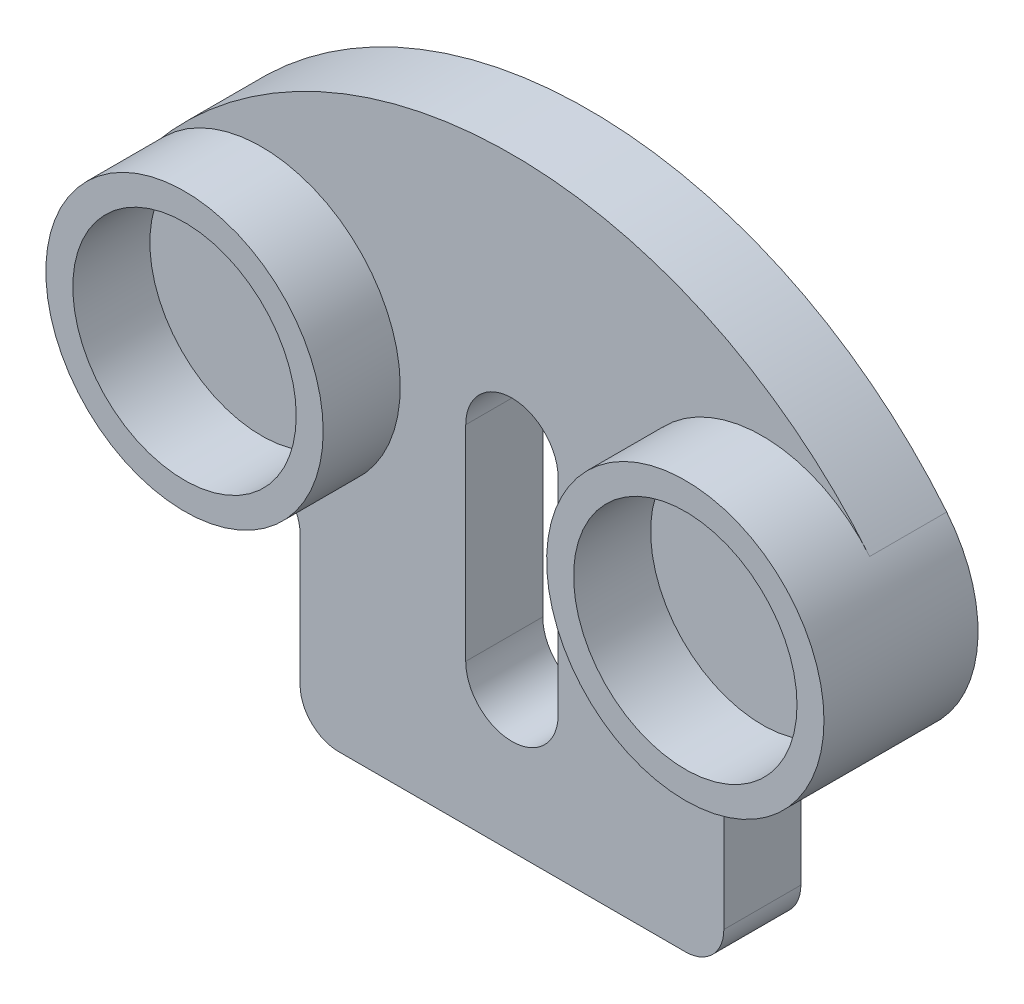
ISO-10303-21;
HEADER;
FILE_DESCRIPTION(('STEP AP214'),'2;1');
FILE_NAME('part.step','',(''),(''),'','','');
FILE_SCHEMA(('AUTOMOTIVE_DESIGN { 1 0 10303 214 1 1 1 1 }'));
ENDSEC;
DATA;
#1=APPLICATION_CONTEXT('core data for automotive mechanical design processes');
#2=APPLICATION_PROTOCOL_DEFINITION('international standard','automotive_design',2000,#1);
#3=PRODUCT_CONTEXT('',#1,'mechanical');
#4=PRODUCT('Part','Part','',(#3));
#5=PRODUCT_RELATED_PRODUCT_CATEGORY('part','',(#4));
#6=PRODUCT_DEFINITION_FORMATION('','',#4);
#7=PRODUCT_DEFINITION_CONTEXT('part definition',#1,'design');
#8=PRODUCT_DEFINITION('design','',#6,#7);
#9=PRODUCT_DEFINITION_SHAPE('','',#8);
#10=(LENGTH_UNIT() NAMED_UNIT(*) SI_UNIT(.MILLI.,.METRE.));
#11=(NAMED_UNIT(*) PLANE_ANGLE_UNIT() SI_UNIT($,.RADIAN.));
#12=(NAMED_UNIT(*) SI_UNIT($,.STERADIAN.) SOLID_ANGLE_UNIT());
#13=UNCERTAINTY_MEASURE_WITH_UNIT(LENGTH_MEASURE(1.E-05),#10,'distance_accuracy_value','');
#14=(GEOMETRIC_REPRESENTATION_CONTEXT(3) GLOBAL_UNCERTAINTY_ASSIGNED_CONTEXT((#13)) GLOBAL_UNIT_ASSIGNED_CONTEXT((#10,
#11,#12)) REPRESENTATION_CONTEXT('',''));
#15=CARTESIAN_POINT('',(0.,0.,0.));
#16=DIRECTION('',(0.,0.,1.));
#17=DIRECTION('',(1.,0.,0.));
#18=AXIS2_PLACEMENT_3D('',#15,#16,#17);
#19=CARTESIAN_POINT('',(0.,26.6035711888461,20.));
#20=DIRECTION('',(0.,0.,-1.));
#21=DIRECTION('',(-1.,0.,0.));
#22=AXIS2_PLACEMENT_3D('',#19,#20,#21);
#23=CYLINDRICAL_SURFACE('',#22,6.);
#24=DIRECTION('',(0.,0.,-1.));
#25=VECTOR('',#24,1.);
#26=CARTESIAN_POINT('',(6.,26.6035711888461,20.));
#27=LINE('',#26,#25);
#28=CARTESIAN_POINT('',(6.,26.6035711888461,10.));
#29=VERTEX_POINT('',#28);
#30=CARTESIAN_POINT('',(6.,26.6035711888461,0.));
#31=VERTEX_POINT('',#30);
#32=EDGE_CURVE('E12',#29,#31,#27,.T.);
#33=ORIENTED_EDGE('',*,*,#32,.F.);
#34=CARTESIAN_POINT('',(0.,26.6035711888461,10.));
#35=DIRECTION('',(0.,0.,1.));
#36=DIRECTION('',(1.,0.,0.));
#37=AXIS2_PLACEMENT_3D('',#34,#35,#36);
#38=CIRCLE('',#37,6.);
#39=CARTESIAN_POINT('',(-6.,26.6035711888461,10.));
#40=VERTEX_POINT('',#39);
#41=EDGE_CURVE('E365',#40,#29,#38,.F.);
#42=ORIENTED_EDGE('',*,*,#41,.F.);
#43=DIRECTION('',(0.,0.,-1.));
#44=VECTOR('',#43,1.);
#45=CARTESIAN_POINT('',(-6.,26.6035711888461,20.));
#46=LINE('',#45,#44);
#47=CARTESIAN_POINT('',(-6.,26.6035711888461,0.));
#48=VERTEX_POINT('',#47);
#49=EDGE_CURVE('E143',#40,#48,#46,.T.);
#50=ORIENTED_EDGE('',*,*,#49,.T.);
#51=CARTESIAN_POINT('',(0.,26.6035711888461,0.));
#52=DIRECTION('',(0.,0.,1.));
#53=DIRECTION('',(1.,0.,0.));
#54=AXIS2_PLACEMENT_3D('',#51,#52,#53);
#55=CIRCLE('',#54,6.);
#56=EDGE_CURVE('E312',#31,#48,#55,.T.);
#57=ORIENTED_EDGE('',*,*,#56,.F.);
#58=EDGE_LOOP('',(#33,#42,#50,#57));
#59=FACE_BOUND('',#58,.T.);
#60=ADVANCED_FACE('F117',(#59),#23,.F.);
#61=CARTESIAN_POINT('',(6.,0.,20.));
#62=DIRECTION('',(1.,0.,0.));
#63=DIRECTION('',(0.,1.,0.));
#64=AXIS2_PLACEMENT_3D('',#61,#62,#63);
#65=PLANE('',#64);
#66=DIRECTION('',(0.,-1.,0.));
#67=VECTOR('',#66,1.);
#68=CARTESIAN_POINT('',(6.,0.,10.));
#69=LINE('',#68,#67);
#70=CARTESIAN_POINT('',(6.,0.,10.));
#71=VERTEX_POINT('',#70);
#72=EDGE_CURVE('E362',#29,#71,#69,.T.);
#73=ORIENTED_EDGE('',*,*,#72,.F.);
#74=ORIENTED_EDGE('',*,*,#32,.T.);
#75=DIRECTION('',(0.,-1.,0.));
#76=VECTOR('',#75,1.);
#77=CARTESIAN_POINT('',(6.,0.,0.));
#78=LINE('',#77,#76);
#79=CARTESIAN_POINT('',(6.,0.,0.));
#80=VERTEX_POINT('',#79);
#81=EDGE_CURVE('E307',#31,#80,#78,.T.);
#82=ORIENTED_EDGE('',*,*,#81,.T.);
#83=DIRECTION('',(0.,0.,-1.));
#84=VECTOR('',#83,1.);
#85=CARTESIAN_POINT('',(6.,0.,20.));
#86=LINE('',#85,#84);
#87=EDGE_CURVE('E127',#71,#80,#86,.T.);
#88=ORIENTED_EDGE('',*,*,#87,.F.);
#89=EDGE_LOOP('',(#73,#74,#82,#88));
#90=FACE_BOUND('',#89,.T.);
#91=ADVANCED_FACE('F308',(#90),#65,.F.);
#92=CARTESIAN_POINT('',(0.,0.,20.));
#93=DIRECTION('',(0.,0.,-1.));
#94=DIRECTION('',(-1.,0.,0.));
#95=AXIS2_PLACEMENT_3D('',#92,#93,#94);
#96=CYLINDRICAL_SURFACE('',#95,6.);
#97=DIRECTION('',(0.,0.,-1.));
#98=VECTOR('',#97,1.);
#99=CARTESIAN_POINT('',(-6.,0.,20.));
#100=LINE('',#99,#98);
#101=CARTESIAN_POINT('',(-6.,0.,10.));
#102=VERTEX_POINT('',#101);
#103=CARTESIAN_POINT('',(-6.,0.,0.));
#104=VERTEX_POINT('',#103);
#105=EDGE_CURVE('E287',#102,#104,#100,.T.);
#106=ORIENTED_EDGE('',*,*,#105,.F.);
#107=CARTESIAN_POINT('',(0.,0.,10.));
#108=DIRECTION('',(0.,0.,1.));
#109=DIRECTION('',(1.,0.,0.));
#110=AXIS2_PLACEMENT_3D('',#107,#108,#109);
#111=CIRCLE('',#110,6.);
#112=EDGE_CURVE('E135',#71,#102,#111,.F.);
#113=ORIENTED_EDGE('',*,*,#112,.F.);
#114=ORIENTED_EDGE('',*,*,#87,.T.);
#115=CARTESIAN_POINT('',(0.,0.,0.));
#116=DIRECTION('',(0.,0.,1.));
#117=DIRECTION('',(1.,0.,0.));
#118=AXIS2_PLACEMENT_3D('',#115,#116,#117);
#119=CIRCLE('',#118,6.);
#120=EDGE_CURVE('E302',#104,#80,#119,.T.);
#121=ORIENTED_EDGE('',*,*,#120,.F.);
#122=EDGE_LOOP('',(#106,#113,#114,#121));
#123=FACE_BOUND('',#122,.T.);
#124=ADVANCED_FACE('F300',(#123),#96,.F.);
#125=CARTESIAN_POINT('',(0.,0.,20.));
#126=DIRECTION('',(0.,0.,-1.));
#127=DIRECTION('',(-1.,0.,0.));
#128=AXIS2_PLACEMENT_3D('',#125,#126,#127);
#129=CYLINDRICAL_SURFACE('',#128,60.);
#130=DIRECTION('',(0.,0.,-1.));
#131=VECTOR('',#130,1.);
#132=CARTESIAN_POINT('',(-46.4285714285714,38.0051016983515,20.));
#133=LINE('',#132,#131);
#134=CARTESIAN_POINT('',(-46.4285714285714,38.0051016983515,10.));
#135=VERTEX_POINT('',#134);
#136=CARTESIAN_POINT('',(-46.4285714285714,38.0051016983515,0.));
#137=VERTEX_POINT('',#136);
#138=EDGE_CURVE('E121',#135,#137,#133,.T.);
#139=ORIENTED_EDGE('',*,*,#138,.F.);
#140=CARTESIAN_POINT('',(0.,0.,10.));
#141=DIRECTION('',(0.,0.,1.));
#142=DIRECTION('',(1.,0.,0.));
#143=AXIS2_PLACEMENT_3D('',#140,#141,#142);
#144=CIRCLE('',#143,60.);
#145=CARTESIAN_POINT('',(46.4285714285714,38.0051016983515,10.));
#146=VERTEX_POINT('',#145);
#147=EDGE_CURVE('E225',#146,#135,#144,.T.);
#148=ORIENTED_EDGE('',*,*,#147,.F.);
#149=DIRECTION('',(0.,0.,-1.));
#150=VECTOR('',#149,1.);
#151=CARTESIAN_POINT('',(46.4285714285714,38.0051016983515,20.));
#152=LINE('',#151,#150);
#153=CARTESIAN_POINT('',(46.4285714285714,38.0051016983515,0.));
#154=VERTEX_POINT('',#153);
#155=EDGE_CURVE('E237',#146,#154,#152,.T.);
#156=ORIENTED_EDGE('',*,*,#155,.T.);
#157=CARTESIAN_POINT('',(0.,0.,0.));
#158=DIRECTION('',(0.,0.,1.));
#159=DIRECTION('',(1.,0.,0.));
#160=AXIS2_PLACEMENT_3D('',#157,#158,#159);
#161=CIRCLE('',#160,60.);
#162=EDGE_CURVE('E354',#137,#154,#161,.F.);
#163=ORIENTED_EDGE('',*,*,#162,.F.);
#164=EDGE_LOOP('',(#139,#148,#156,#163));
#165=FACE_BOUND('',#164,.T.);
#166=ADVANCED_FACE('F119',(#165),#129,.T.);
#167=CARTESIAN_POINT('',(-32.5,3.60357118884606,20.));
#168=DIRECTION('',(0.,0.,-1.));
#169=DIRECTION('',(-1.,0.,0.));
#170=AXIS2_PLACEMENT_3D('',#167,#168,#169);
#171=CYLINDRICAL_SURFACE('',#170,5.);
#172=DIRECTION('',(0.,0.,-1.));
#173=VECTOR('',#172,1.);
#174=CARTESIAN_POINT('',(-27.5,3.60357118884606,20.));
#175=LINE('',#174,#173);
#176=CARTESIAN_POINT('',(-27.5,3.60357118884606,10.));
#177=VERTEX_POINT('',#176);
#178=CARTESIAN_POINT('',(-27.5,3.60357118884606,0.));
#179=VERTEX_POINT('',#178);
#180=EDGE_CURVE('E274',#177,#179,#175,.T.);
#181=ORIENTED_EDGE('',*,*,#180,.F.);
#182=CARTESIAN_POINT('',(-32.5,3.60357118884606,10.));
#183=DIRECTION('',(0.,0.,1.));
#184=DIRECTION('',(1.,0.,0.));
#185=AXIS2_PLACEMENT_3D('',#182,#183,#184);
#186=CIRCLE('',#185,5.);
#187=CARTESIAN_POINT('',(-32.5,8.60357118884606,10.));
#188=VERTEX_POINT('',#187);
#189=EDGE_CURVE('E388',#188,#177,#186,.F.);
#190=ORIENTED_EDGE('',*,*,#189,.F.);
#191=DIRECTION('',(0.,0.,-1.));
#192=VECTOR('',#191,1.);
#193=CARTESIAN_POINT('',(-32.5,8.60357118884605,20.));
#194=LINE('',#193,#192);
#195=CARTESIAN_POINT('',(-32.5,8.60357118884605,0.));
#196=VERTEX_POINT('',#195);
#197=EDGE_CURVE('E276',#188,#196,#194,.T.);
#198=ORIENTED_EDGE('',*,*,#197,.T.);
#199=CARTESIAN_POINT('',(-32.5,3.60357118884606,0.));
#200=DIRECTION('',(0.,0.,1.));
#201=DIRECTION('',(1.,0.,0.));
#202=AXIS2_PLACEMENT_3D('',#199,#200,#201);
#203=CIRCLE('',#202,5.);
#204=EDGE_CURVE('E347',#179,#196,#203,.T.);
#205=ORIENTED_EDGE('',*,*,#204,.F.);
#206=EDGE_LOOP('',(#181,#190,#198,#205));
#207=FACE_BOUND('',#206,.T.);
#208=ADVANCED_FACE('F462',(#207),#171,.F.);
#209=CARTESIAN_POINT('',(-27.5,0.,20.));
#210=DIRECTION('',(-1.,0.,0.));
#211=DIRECTION('',(0.,0.,1.));
#212=AXIS2_PLACEMENT_3D('',#209,#210,#211);
#213=PLANE('',#212);
#214=DIRECTION('',(0.,0.,-1.));
#215=VECTOR('',#214,1.);
#216=CARTESIAN_POINT('',(-27.5,-13.3964288111539,20.));
#217=LINE('',#216,#215);
#218=CARTESIAN_POINT('',(-27.5,-13.3964288111539,10.));
#219=VERTEX_POINT('',#218);
#220=CARTESIAN_POINT('',(-27.5,-13.3964288111539,0.));
#221=VERTEX_POINT('',#220);
#222=EDGE_CURVE('E271',#219,#221,#217,.T.);
#223=ORIENTED_EDGE('',*,*,#222,.F.);
#224=DIRECTION('',(0.,-1.,0.));
#225=VECTOR('',#224,1.);
#226=CARTESIAN_POINT('',(-27.5,0.,10.));
#227=LINE('',#226,#225);
#228=EDGE_CURVE('E385',#177,#219,#227,.T.);
#229=ORIENTED_EDGE('',*,*,#228,.F.);
#230=ORIENTED_EDGE('',*,*,#180,.T.);
#231=DIRECTION('',(0.,1.,0.));
#232=VECTOR('',#231,1.);
#233=CARTESIAN_POINT('',(-27.5,0.,0.));
#234=LINE('',#233,#232);
#235=EDGE_CURVE('E343',#221,#179,#234,.T.);
#236=ORIENTED_EDGE('',*,*,#235,.F.);
#237=EDGE_LOOP('',(#223,#229,#230,#236));
#238=FACE_BOUND('',#237,.T.);
#239=ADVANCED_FACE('F459',(#238),#213,.T.);
#240=CARTESIAN_POINT('',(-22.5,-13.3964288111539,20.));
#241=DIRECTION('',(0.,0.,-1.));
#242=DIRECTION('',(-1.,0.,0.));
#243=AXIS2_PLACEMENT_3D('',#240,#241,#242);
#244=CYLINDRICAL_SURFACE('',#243,5.);
#245=DIRECTION('',(0.,0.,-1.));
#246=VECTOR('',#245,1.);
#247=CARTESIAN_POINT('',(-22.5,-18.3964288111539,20.));
#248=LINE('',#247,#246);
#249=CARTESIAN_POINT('',(-22.5,-18.3964288111539,10.));
#250=VERTEX_POINT('',#249);
#251=CARTESIAN_POINT('',(-22.5,-18.3964288111539,0.));
#252=VERTEX_POINT('',#251);
#253=EDGE_CURVE('E268',#250,#252,#248,.T.);
#254=ORIENTED_EDGE('',*,*,#253,.F.);
#255=CARTESIAN_POINT('',(-22.5,-13.3964288111539,10.));
#256=DIRECTION('',(0.,0.,1.));
#257=DIRECTION('',(1.,0.,0.));
#258=AXIS2_PLACEMENT_3D('',#255,#256,#257);
#259=CIRCLE('',#258,5.);
#260=EDGE_CURVE('E382',#219,#250,#259,.T.);
#261=ORIENTED_EDGE('',*,*,#260,.F.);
#262=ORIENTED_EDGE('',*,*,#222,.T.);
#263=CARTESIAN_POINT('',(-22.5,-13.3964288111539,0.));
#264=DIRECTION('',(0.,0.,1.));
#265=DIRECTION('',(1.,0.,0.));
#266=AXIS2_PLACEMENT_3D('',#263,#264,#265);
#267=CIRCLE('',#266,5.);
#268=EDGE_CURVE('E339',#252,#221,#267,.F.);
#269=ORIENTED_EDGE('',*,*,#268,.F.);
#270=EDGE_LOOP('',(#254,#261,#262,#269));
#271=FACE_BOUND('',#270,.T.);
#272=ADVANCED_FACE('F455',(#271),#244,.T.);
#273=CARTESIAN_POINT('',(0.,-18.3964288111539,20.));
#274=DIRECTION('',(0.,1.,0.));
#275=DIRECTION('',(-1.,0.,0.));
#276=AXIS2_PLACEMENT_3D('',#273,#274,#275);
#277=PLANE('',#276);
#278=DIRECTION('',(1.,0.,0.));
#279=VECTOR('',#278,1.);
#280=CARTESIAN_POINT('',(0.,-18.3964288111539,10.));
#281=LINE('',#280,#279);
#282=CARTESIAN_POINT('',(22.5,-18.3964288111539,10.));
#283=VERTEX_POINT('',#282);
#284=EDGE_CURVE('E379',#250,#283,#281,.T.);
#285=ORIENTED_EDGE('',*,*,#284,.F.);
#286=ORIENTED_EDGE('',*,*,#253,.T.);
#287=DIRECTION('',(1.,0.,0.));
#288=VECTOR('',#287,1.);
#289=CARTESIAN_POINT('',(0.,-18.3964288111539,0.));
#290=LINE('',#289,#288);
#291=CARTESIAN_POINT('',(22.5,-18.3964288111539,0.));
#292=VERTEX_POINT('',#291);
#293=EDGE_CURVE('E335',#252,#292,#290,.T.);
#294=ORIENTED_EDGE('',*,*,#293,.T.);
#295=DIRECTION('',(0.,0.,-1.));
#296=VECTOR('',#295,1.);
#297=CARTESIAN_POINT('',(22.5,-18.3964288111539,20.));
#298=LINE('',#297,#296);
#299=EDGE_CURVE('E265',#283,#292,#298,.T.);
#300=ORIENTED_EDGE('',*,*,#299,.F.);
#301=EDGE_LOOP('',(#285,#286,#294,#300));
#302=FACE_BOUND('',#301,.T.);
#303=ADVANCED_FACE('F451',(#302),#277,.F.);
#304=CARTESIAN_POINT('',(22.5,-13.3964288111539,20.));
#305=DIRECTION('',(0.,0.,-1.));
#306=DIRECTION('',(-1.,0.,0.));
#307=AXIS2_PLACEMENT_3D('',#304,#305,#306);
#308=CYLINDRICAL_SURFACE('',#307,5.);
#309=CARTESIAN_POINT('',(22.5,-13.3964288111539,10.));
#310=DIRECTION('',(0.,0.,1.));
#311=DIRECTION('',(1.,0.,0.));
#312=AXIS2_PLACEMENT_3D('',#309,#310,#311);
#313=CIRCLE('',#312,5.);
#314=CARTESIAN_POINT('',(27.5,-13.3964288111539,10.));
#315=VERTEX_POINT('',#314);
#316=EDGE_CURVE('E376',#283,#315,#313,.T.);
#317=ORIENTED_EDGE('',*,*,#316,.F.);
#318=ORIENTED_EDGE('',*,*,#299,.T.);
#319=CARTESIAN_POINT('',(22.5,-13.3964288111539,0.));
#320=DIRECTION('',(0.,0.,1.));
#321=DIRECTION('',(1.,0.,0.));
#322=AXIS2_PLACEMENT_3D('',#319,#320,#321);
#323=CIRCLE('',#322,5.);
#324=CARTESIAN_POINT('',(27.5,-13.3964288111539,0.));
#325=VERTEX_POINT('',#324);
#326=EDGE_CURVE('E331',#292,#325,#323,.T.);
#327=ORIENTED_EDGE('',*,*,#326,.T.);
#328=DIRECTION('',(0.,0.,-1.));
#329=VECTOR('',#328,1.);
#330=CARTESIAN_POINT('',(27.5,-13.3964288111539,20.));
#331=LINE('',#330,#329);
#332=EDGE_CURVE('E262',#315,#325,#331,.T.);
#333=ORIENTED_EDGE('',*,*,#332,.F.);
#334=EDGE_LOOP('',(#317,#318,#327,#333));
#335=FACE_BOUND('',#334,.T.);
#336=ADVANCED_FACE('F447',(#335),#308,.T.);
#337=CARTESIAN_POINT('',(27.5,0.,20.));
#338=DIRECTION('',(-1.,0.,0.));
#339=DIRECTION('',(0.,0.,1.));
#340=AXIS2_PLACEMENT_3D('',#337,#338,#339);
#341=PLANE('',#340);
#342=DIRECTION('',(0.,1.,0.));
#343=VECTOR('',#342,1.);
#344=CARTESIAN_POINT('',(27.5,0.,10.));
#345=LINE('',#344,#343);
#346=CARTESIAN_POINT('',(27.5,3.60357118884606,10.));
#347=VERTEX_POINT('',#346);
#348=EDGE_CURVE('E373',#315,#347,#345,.T.);
#349=ORIENTED_EDGE('',*,*,#348,.F.);
#350=ORIENTED_EDGE('',*,*,#332,.T.);
#351=DIRECTION('',(0.,1.,0.));
#352=VECTOR('',#351,1.);
#353=CARTESIAN_POINT('',(27.5,0.,0.));
#354=LINE('',#353,#352);
#355=CARTESIAN_POINT('',(27.5,3.60357118884606,0.));
#356=VERTEX_POINT('',#355);
#357=EDGE_CURVE('E327',#325,#356,#354,.T.);
#358=ORIENTED_EDGE('',*,*,#357,.T.);
#359=DIRECTION('',(0.,0.,-1.));
#360=VECTOR('',#359,1.);
#361=CARTESIAN_POINT('',(27.5,3.60357118884606,20.));
#362=LINE('',#361,#360);
#363=EDGE_CURVE('E253',#347,#356,#362,.T.);
#364=ORIENTED_EDGE('',*,*,#363,.F.);
#365=EDGE_LOOP('',(#349,#350,#358,#364));
#366=FACE_BOUND('',#365,.T.);
#367=ADVANCED_FACE('F443',(#366),#341,.F.);
#368=CARTESIAN_POINT('',(32.5,3.60357118884606,20.));
#369=DIRECTION('',(0.,0.,-1.));
#370=DIRECTION('',(-1.,0.,0.));
#371=AXIS2_PLACEMENT_3D('',#368,#369,#370);
#372=CYLINDRICAL_SURFACE('',#371,5.);
#373=CARTESIAN_POINT('',(32.5,3.60357118884606,10.));
#374=DIRECTION('',(0.,0.,1.));
#375=DIRECTION('',(1.,0.,0.));
#376=AXIS2_PLACEMENT_3D('',#373,#374,#375);
#377=CIRCLE('',#376,5.);
#378=CARTESIAN_POINT('',(32.5,8.60357118884604,10.));
#379=VERTEX_POINT('',#378);
#380=EDGE_CURVE('E228',#347,#379,#377,.F.);
#381=ORIENTED_EDGE('',*,*,#380,.F.);
#382=ORIENTED_EDGE('',*,*,#363,.T.);
#383=CARTESIAN_POINT('',(32.5,3.60357118884606,0.));
#384=DIRECTION('',(0.,0.,1.));
#385=DIRECTION('',(1.,0.,0.));
#386=AXIS2_PLACEMENT_3D('',#383,#384,#385);
#387=CIRCLE('',#386,5.);
#388=CARTESIAN_POINT('',(32.5,8.60357118884605,0.));
#389=VERTEX_POINT('',#388);
#390=EDGE_CURVE('E323',#356,#389,#387,.F.);
#391=ORIENTED_EDGE('',*,*,#390,.T.);
#392=DIRECTION('',(0.,0.,-1.));
#393=VECTOR('',#392,1.);
#394=CARTESIAN_POINT('',(32.5,8.60357118884605,20.));
#395=LINE('',#394,#393);
#396=EDGE_CURVE('E248',#379,#389,#395,.T.);
#397=ORIENTED_EDGE('',*,*,#396,.F.);
#398=EDGE_LOOP('',(#381,#382,#391,#397));
#399=FACE_BOUND('',#398,.T.);
#400=ADVANCED_FACE('F439',(#399),#372,.F.);
#401=CARTESIAN_POINT('',(-6.,0.,20.));
#402=DIRECTION('',(1.,0.,0.));
#403=DIRECTION('',(0.,1.,0.));
#404=AXIS2_PLACEMENT_3D('',#401,#402,#403);
#405=PLANE('',#404);
#406=ORIENTED_EDGE('',*,*,#49,.F.);
#407=DIRECTION('',(0.,1.,0.));
#408=VECTOR('',#407,1.);
#409=CARTESIAN_POINT('',(-6.,0.,10.));
#410=LINE('',#409,#408);
#411=EDGE_CURVE('E368',#102,#40,#410,.T.);
#412=ORIENTED_EDGE('',*,*,#411,.F.);
#413=ORIENTED_EDGE('',*,*,#105,.T.);
#414=DIRECTION('',(0.,-1.,0.));
#415=VECTOR('',#414,1.);
#416=CARTESIAN_POINT('',(-6.,0.,0.));
#417=LINE('',#416,#415);
#418=EDGE_CURVE('E292',#48,#104,#417,.T.);
#419=ORIENTED_EDGE('',*,*,#418,.F.);
#420=EDGE_LOOP('',(#406,#412,#413,#419));
#421=FACE_BOUND('',#420,.T.);
#422=ADVANCED_FACE('F442',(#421),#405,.T.);
#423=CARTESIAN_POINT('',(0.,0.,20.));
#424=DIRECTION('',(0.,0.,1.));
#425=DIRECTION('',(1.,0.,0.));
#426=AXIS2_PLACEMENT_3D('',#423,#424,#425);
#427=PLANE('',#426);
#428=CARTESIAN_POINT('',(32.5,26.6035711888461,20.));
#429=DIRECTION('',(0.,0.,1.));
#430=DIRECTION('',(1.,0.,0.));
#431=AXIS2_PLACEMENT_3D('',#428,#429,#430);
#432=CIRCLE('',#431,14.5);
#433=CARTESIAN_POINT('',(47.,26.6035711888461,20.));
#434=VERTEX_POINT('',#433);
#435=EDGE_CURVE('E393',#434,#434,#432,.T.);
#436=ORIENTED_EDGE('',*,*,#435,.F.);
#437=EDGE_LOOP('',(#436));
#438=FACE_BOUND('',#437,.T.);
#439=CARTESIAN_POINT('',(32.5,26.6035711888461,20.));
#440=DIRECTION('',(0.,0.,1.));
#441=DIRECTION('',(1.,0.,0.));
#442=AXIS2_PLACEMENT_3D('',#439,#440,#441);
#443=CIRCLE('',#442,18.);
#444=CARTESIAN_POINT('',(50.5,26.6035711888461,20.));
#445=VERTEX_POINT('',#444);
#446=EDGE_CURVE('E249',#445,#445,#443,.T.);
#447=ORIENTED_EDGE('',*,*,#446,.T.);
#448=EDGE_LOOP('',(#447));
#449=FACE_BOUND('',#448,.T.);
#450=ADVANCED_FACE('F421',(#438,#449),#427,.T.);
#451=CARTESIAN_POINT('',(-32.5,26.6035711888461,20.));
#452=DIRECTION('',(0.,0.,1.));
#453=DIRECTION('',(1.,0.,0.));
#454=AXIS2_PLACEMENT_3D('',#451,#452,#453);
#455=CIRCLE('',#454,14.5);
#456=CARTESIAN_POINT('',(-18.,26.6035711888461,20.));
#457=VERTEX_POINT('',#456);
#458=EDGE_CURVE('E401',#457,#457,#455,.T.);
#459=ORIENTED_EDGE('',*,*,#458,.F.);
#460=EDGE_LOOP('',(#459));
#461=FACE_BOUND('',#460,.T.);
#462=CARTESIAN_POINT('',(-32.5,26.6035711888461,20.));
#463=DIRECTION('',(0.,0.,1.));
#464=DIRECTION('',(1.,0.,0.));
#465=AXIS2_PLACEMENT_3D('',#462,#463,#464);
#466=CIRCLE('',#465,18.);
#467=CARTESIAN_POINT('',(-14.5,26.6035711888461,20.));
#468=VERTEX_POINT('',#467);
#469=EDGE_CURVE('E256',#468,#468,#466,.T.);
#470=ORIENTED_EDGE('',*,*,#469,.T.);
#471=EDGE_LOOP('',(#470));
#472=FACE_BOUND('',#471,.T.);
#473=ADVANCED_FACE('F417',(#461,#472),#427,.T.);
#474=CARTESIAN_POINT('',(-32.5,26.6035711888461,20.));
#475=DIRECTION('',(0.,0.,-1.));
#476=DIRECTION('',(-1.,0.,0.));
#477=AXIS2_PLACEMENT_3D('',#474,#475,#476);
#478=CYLINDRICAL_SURFACE('',#477,18.);
#479=CARTESIAN_POINT('',(-32.5,26.6035711888461,10.));
#480=DIRECTION('',(0.,0.,1.));
#481=DIRECTION('',(1.,0.,0.));
#482=AXIS2_PLACEMENT_3D('',#479,#480,#481);
#483=CIRCLE('',#482,18.);
#484=EDGE_CURVE('E240',#188,#135,#483,.T.);
#485=ORIENTED_EDGE('',*,*,#484,.T.);
#486=ORIENTED_EDGE('',*,*,#138,.T.);
#487=CARTESIAN_POINT('',(-32.5,26.6035711888461,0.));
#488=DIRECTION('',(0.,0.,1.));
#489=DIRECTION('',(1.,0.,0.));
#490=AXIS2_PLACEMENT_3D('',#487,#488,#489);
#491=CIRCLE('',#490,18.);
#492=EDGE_CURVE('E351',#137,#196,#491,.T.);
#493=ORIENTED_EDGE('',*,*,#492,.T.);
#494=ORIENTED_EDGE('',*,*,#197,.F.);
#495=EDGE_LOOP('',(#485,#486,#493,#494));
#496=FACE_BOUND('',#495,.T.);
#497=ORIENTED_EDGE('',*,*,#469,.F.);
#498=EDGE_LOOP('',(#497));
#499=FACE_BOUND('',#498,.T.);
#500=ADVANCED_FACE('F420',(#496,#499),#478,.T.);
#501=CARTESIAN_POINT('',(32.5,26.6035711888461,20.));
#502=DIRECTION('',(0.,0.,-1.));
#503=DIRECTION('',(-1.,0.,0.));
#504=AXIS2_PLACEMENT_3D('',#501,#502,#503);
#505=CYLINDRICAL_SURFACE('',#504,18.);
#506=CARTESIAN_POINT('',(32.5,26.6035711888461,10.));
#507=DIRECTION('',(0.,0.,1.));
#508=DIRECTION('',(1.,0.,0.));
#509=AXIS2_PLACEMENT_3D('',#506,#507,#508);
#510=CIRCLE('',#509,18.);
#511=EDGE_CURVE('E222',#146,#379,#510,.T.);
#512=ORIENTED_EDGE('',*,*,#511,.T.);
#513=ORIENTED_EDGE('',*,*,#396,.T.);
#514=CARTESIAN_POINT('',(32.5,26.6035711888461,0.));
#515=DIRECTION('',(0.,0.,1.));
#516=DIRECTION('',(1.,0.,0.));
#517=AXIS2_PLACEMENT_3D('',#514,#515,#516);
#518=CIRCLE('',#517,18.);
#519=EDGE_CURVE('E245',#389,#154,#518,.T.);
#520=ORIENTED_EDGE('',*,*,#519,.T.);
#521=ORIENTED_EDGE('',*,*,#155,.F.);
#522=EDGE_LOOP('',(#512,#513,#520,#521));
#523=FACE_BOUND('',#522,.T.);
#524=ORIENTED_EDGE('',*,*,#446,.F.);
#525=EDGE_LOOP('',(#524));
#526=FACE_BOUND('',#525,.T.);
#527=ADVANCED_FACE('F242',(#523,#526),#505,.T.);
#528=CARTESIAN_POINT('',(0.,0.,0.));
#529=DIRECTION('',(0.,0.,1.));
#530=DIRECTION('',(1.,0.,0.));
#531=AXIS2_PLACEMENT_3D('',#528,#529,#530);
#532=PLANE('',#531);
#533=ORIENTED_EDGE('',*,*,#162,.T.);
#534=ORIENTED_EDGE('',*,*,#519,.F.);
#535=ORIENTED_EDGE('',*,*,#390,.F.);
#536=ORIENTED_EDGE('',*,*,#357,.F.);
#537=ORIENTED_EDGE('',*,*,#326,.F.);
#538=ORIENTED_EDGE('',*,*,#293,.F.);
#539=ORIENTED_EDGE('',*,*,#268,.T.);
#540=ORIENTED_EDGE('',*,*,#235,.T.);
#541=ORIENTED_EDGE('',*,*,#204,.T.);
#542=ORIENTED_EDGE('',*,*,#492,.F.);
#543=EDGE_LOOP('',(#533,#534,#535,#536,#537,#538,#539,#540,#541,#542));
#544=FACE_BOUND('',#543,.T.);
#545=ORIENTED_EDGE('',*,*,#56,.T.);
#546=ORIENTED_EDGE('',*,*,#418,.T.);
#547=ORIENTED_EDGE('',*,*,#120,.T.);
#548=ORIENTED_EDGE('',*,*,#81,.F.);
#549=EDGE_LOOP('',(#545,#546,#547,#548));
#550=FACE_BOUND('',#549,.T.);
#551=ADVANCED_FACE('F314',(#544,#550),#532,.F.);
#552=CARTESIAN_POINT('',(0.,0.,10.));
#553=DIRECTION('',(0.,0.,1.));
#554=DIRECTION('',(1.,0.,0.));
#555=AXIS2_PLACEMENT_3D('',#552,#553,#554);
#556=PLANE('',#555);
#557=ORIENTED_EDGE('',*,*,#511,.F.);
#558=ORIENTED_EDGE('',*,*,#147,.T.);
#559=ORIENTED_EDGE('',*,*,#484,.F.);
#560=ORIENTED_EDGE('',*,*,#189,.T.);
#561=ORIENTED_EDGE('',*,*,#228,.T.);
#562=ORIENTED_EDGE('',*,*,#260,.T.);
#563=ORIENTED_EDGE('',*,*,#284,.T.);
#564=ORIENTED_EDGE('',*,*,#316,.T.);
#565=ORIENTED_EDGE('',*,*,#348,.T.);
#566=ORIENTED_EDGE('',*,*,#380,.T.);
#567=EDGE_LOOP('',(#557,#558,#559,#560,#561,#562,#563,#564,#565,#566));
#568=FACE_BOUND('',#567,.T.);
#569=ORIENTED_EDGE('',*,*,#411,.T.);
#570=ORIENTED_EDGE('',*,*,#41,.T.);
#571=ORIENTED_EDGE('',*,*,#72,.T.);
#572=ORIENTED_EDGE('',*,*,#112,.T.);
#573=EDGE_LOOP('',(#569,#570,#571,#572));
#574=FACE_BOUND('',#573,.T.);
#575=ADVANCED_FACE('F224',(#568,#574),#556,.T.);
#576=CARTESIAN_POINT('',(-32.5,26.6035711888461,10.));
#577=DIRECTION('',(0.,0.,1.));
#578=DIRECTION('',(1.,0.,0.));
#579=AXIS2_PLACEMENT_3D('',#576,#577,#578);
#580=CYLINDRICAL_SURFACE('',#579,14.5);
#581=CARTESIAN_POINT('',(-32.5,26.6035711888461,10.));
#582=DIRECTION('',(0.,0.,1.));
#583=DIRECTION('',(1.,0.,0.));
#584=AXIS2_PLACEMENT_3D('',#581,#582,#583);
#585=CIRCLE('',#584,14.5);
#586=CARTESIAN_POINT('',(-18.,26.6035711888461,10.));
#587=VERTEX_POINT('',#586);
#588=EDGE_CURVE('E233',#587,#587,#585,.T.);
#589=ORIENTED_EDGE('',*,*,#588,.F.);
#590=EDGE_LOOP('',(#589));
#591=FACE_BOUND('',#590,.T.);
#592=ORIENTED_EDGE('',*,*,#458,.T.);
#593=EDGE_LOOP('',(#592));
#594=FACE_BOUND('',#593,.T.);
#595=ADVANCED_FACE('F411',(#591,#594),#580,.F.);
#596=CARTESIAN_POINT('',(0.,0.,10.));
#597=DIRECTION('',(0.,0.,1.));
#598=DIRECTION('',(1.,0.,0.));
#599=AXIS2_PLACEMENT_3D('',#596,#597,#598);
#600=PLANE('',#599);
#601=ORIENTED_EDGE('',*,*,#588,.T.);
#602=EDGE_LOOP('',(#601));
#603=FACE_BOUND('',#602,.T.);
#604=ADVANCED_FACE('F409',(#603),#600,.T.);
#605=CARTESIAN_POINT('',(32.5,26.6035711888461,10.));
#606=DIRECTION('',(0.,0.,1.));
#607=DIRECTION('',(1.,0.,0.));
#608=AXIS2_PLACEMENT_3D('',#605,#606,#607);
#609=CYLINDRICAL_SURFACE('',#608,14.5);
#610=CARTESIAN_POINT('',(32.5,26.6035711888461,10.));
#611=DIRECTION('',(0.,0.,1.));
#612=DIRECTION('',(1.,0.,0.));
#613=AXIS2_PLACEMENT_3D('',#610,#611,#612);
#614=CIRCLE('',#613,14.5);
#615=CARTESIAN_POINT('',(47.,26.6035711888461,10.));
#616=VERTEX_POINT('',#615);
#617=EDGE_CURVE('E397',#616,#616,#614,.T.);
#618=ORIENTED_EDGE('',*,*,#617,.F.);
#619=EDGE_LOOP('',(#618));
#620=FACE_BOUND('',#619,.T.);
#621=ORIENTED_EDGE('',*,*,#435,.T.);
#622=EDGE_LOOP('',(#621));
#623=FACE_BOUND('',#622,.T.);
#624=ADVANCED_FACE('F601',(#620,#623),#609,.F.);
#625=CARTESIAN_POINT('',(0.,0.,10.));
#626=DIRECTION('',(0.,0.,1.));
#627=DIRECTION('',(1.,0.,0.));
#628=AXIS2_PLACEMENT_3D('',#625,#626,#627);
#629=PLANE('',#628);
#630=ORIENTED_EDGE('',*,*,#617,.T.);
#631=EDGE_LOOP('',(#630));
#632=FACE_BOUND('',#631,.T.);
#633=ADVANCED_FACE('F611',(#632),#629,.T.);
#634=CLOSED_SHELL('',(#60,#91,#124,#166,#208,#239,#272,#303,#336,#367,#400,#422,#450,#473,#500,
#527,#551,#575,#595,#604,#624,#633));
#635=MANIFOLD_SOLID_BREP('B2',#634);
#636=ADVANCED_BREP_SHAPE_REPRESENTATION('',(#18,#635),#14);
#637=SHAPE_DEFINITION_REPRESENTATION(#9,#636);
ENDSEC;
END-ISO-10303-21;
